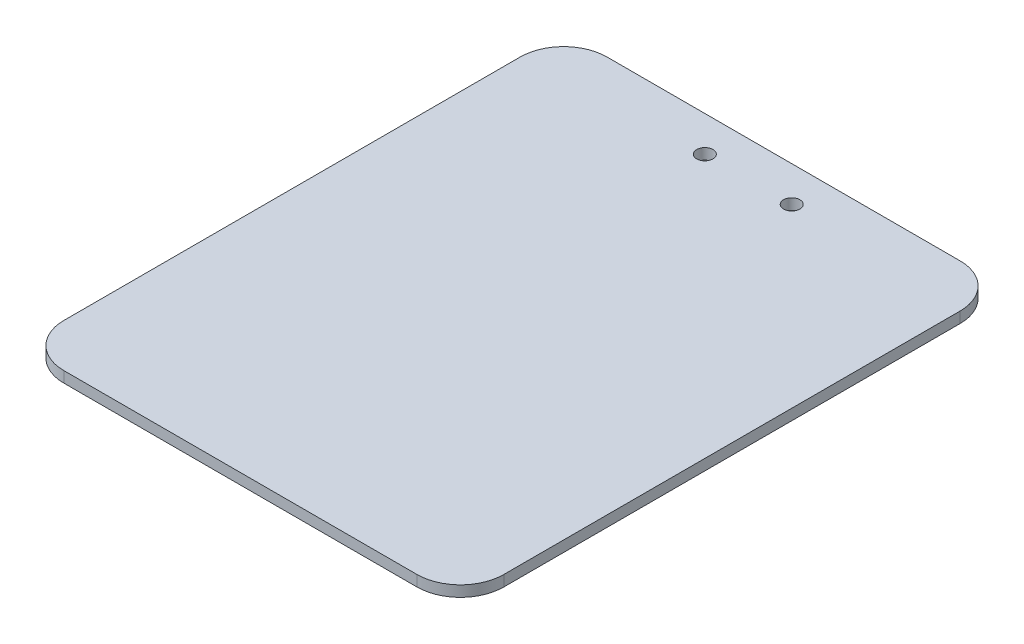
ISO-10303-21;
HEADER;
FILE_DESCRIPTION(('STEP AP214'),'2;1');
FILE_NAME('part.step','',(''),(''),'','','');
FILE_SCHEMA(('AUTOMOTIVE_DESIGN { 1 0 10303 214 1 1 1 1 }'));
ENDSEC;
DATA;
#1=APPLICATION_CONTEXT('core data for automotive mechanical design processes');
#2=APPLICATION_PROTOCOL_DEFINITION('international standard','automotive_design',2000,#1);
#3=PRODUCT_CONTEXT('',#1,'mechanical');
#4=PRODUCT('Part','Part','',(#3));
#5=PRODUCT_RELATED_PRODUCT_CATEGORY('part','',(#4));
#6=PRODUCT_DEFINITION_FORMATION('','',#4);
#7=PRODUCT_DEFINITION_CONTEXT('part definition',#1,'design');
#8=PRODUCT_DEFINITION('design','',#6,#7);
#9=PRODUCT_DEFINITION_SHAPE('','',#8);
#10=(LENGTH_UNIT() NAMED_UNIT(*) SI_UNIT(.MILLI.,.METRE.));
#11=(NAMED_UNIT(*) PLANE_ANGLE_UNIT() SI_UNIT($,.RADIAN.));
#12=(NAMED_UNIT(*) SI_UNIT($,.STERADIAN.) SOLID_ANGLE_UNIT());
#13=UNCERTAINTY_MEASURE_WITH_UNIT(LENGTH_MEASURE(1.E-05),#10,'distance_accuracy_value','');
#14=(GEOMETRIC_REPRESENTATION_CONTEXT(3) GLOBAL_UNCERTAINTY_ASSIGNED_CONTEXT((#13)) GLOBAL_UNIT_ASSIGNED_CONTEXT((#10,
#11,#12)) REPRESENTATION_CONTEXT('',''));
#15=CARTESIAN_POINT('',(0.,0.,0.));
#16=DIRECTION('',(0.,0.,1.));
#17=DIRECTION('',(1.,0.,0.));
#18=AXIS2_PLACEMENT_3D('',#15,#16,#17);
#19=CARTESIAN_POINT('',(8.,2.,-8.));
#20=DIRECTION('',(0.,-1.,0.));
#21=DIRECTION('',(0.,0.,-1.));
#22=AXIS2_PLACEMENT_3D('',#19,#20,#21);
#23=PLANE('',#22);
#24=CARTESIAN_POINT('',(8.,2.,-8.));
#25=DIRECTION('',(0.,1.,0.));
#26=DIRECTION('',(0.,0.,-1.));
#27=AXIS2_PLACEMENT_3D('',#24,#25,#26);
#28=CIRCLE('',#27,8.);
#29=CARTESIAN_POINT('',(0.,2.,-8.00000000000006));
#30=VERTEX_POINT('',#29);
#31=CARTESIAN_POINT('',(8.00000000000006,2.,0.));
#32=VERTEX_POINT('',#31);
#33=EDGE_CURVE('E170',#30,#32,#28,.T.);
#34=ORIENTED_EDGE('',*,*,#33,.T.);
#35=DIRECTION('',(1.,0.,0.));
#36=VECTOR('',#35,1.);
#37=CARTESIAN_POINT('',(8.00000000000006,2.,0.));
#38=LINE('',#37,#36);
#39=CARTESIAN_POINT('',(72.9999999999999,2.,0.));
#40=VERTEX_POINT('',#39);
#41=EDGE_CURVE('E106',#32,#40,#38,.T.);
#42=ORIENTED_EDGE('',*,*,#41,.T.);
#43=CARTESIAN_POINT('',(73.,2.,-8.));
#44=DIRECTION('',(0.,1.,0.));
#45=DIRECTION('',(0.,0.,1.));
#46=AXIS2_PLACEMENT_3D('',#43,#44,#45);
#47=CIRCLE('',#46,8.);
#48=CARTESIAN_POINT('',(81.,2.,-8.00000000000005));
#49=VERTEX_POINT('',#48);
#50=EDGE_CURVE('E191',#40,#49,#47,.T.);
#51=ORIENTED_EDGE('',*,*,#50,.T.);
#52=DIRECTION('',(0.,0.,-1.));
#53=VECTOR('',#52,1.);
#54=CARTESIAN_POINT('',(81.,2.,-8.00000000000006));
#55=LINE('',#54,#53);
#56=CARTESIAN_POINT('',(81.,2.,-91.9999999999999));
#57=VERTEX_POINT('',#56);
#58=EDGE_CURVE('E205',#49,#57,#55,.T.);
#59=ORIENTED_EDGE('',*,*,#58,.T.);
#60=CARTESIAN_POINT('',(73.,2.,-92.));
#61=DIRECTION('',(0.,1.,0.));
#62=DIRECTION('',(0.,0.,-1.));
#63=AXIS2_PLACEMENT_3D('',#60,#61,#62);
#64=CIRCLE('',#63,7.99999999999999);
#65=CARTESIAN_POINT('',(72.9999999999999,2.,-100.));
#66=VERTEX_POINT('',#65);
#67=EDGE_CURVE('E125',#57,#66,#64,.T.);
#68=ORIENTED_EDGE('',*,*,#67,.T.);
#69=DIRECTION('',(-1.,0.,0.));
#70=VECTOR('',#69,1.);
#71=CARTESIAN_POINT('',(8.00000000000006,2.,-100.));
#72=LINE('',#71,#70);
#73=CARTESIAN_POINT('',(8.00000000000006,2.,-100.));
#74=VERTEX_POINT('',#73);
#75=EDGE_CURVE('E119',#66,#74,#72,.T.);
#76=ORIENTED_EDGE('',*,*,#75,.T.);
#77=CARTESIAN_POINT('',(8.,2.,-92.));
#78=DIRECTION('',(0.,1.,0.));
#79=DIRECTION('',(0.,0.,-1.));
#80=AXIS2_PLACEMENT_3D('',#77,#78,#79);
#81=CIRCLE('',#80,8.);
#82=CARTESIAN_POINT('',(0.,2.,-91.9999999999999));
#83=VERTEX_POINT('',#82);
#84=EDGE_CURVE('E123',#74,#83,#81,.T.);
#85=ORIENTED_EDGE('',*,*,#84,.T.);
#86=DIRECTION('',(0.,0.,1.));
#87=VECTOR('',#86,1.);
#88=CARTESIAN_POINT('',(0.,2.,-8.00000000000006));
#89=LINE('',#88,#87);
#90=EDGE_CURVE('E63',#83,#30,#89,.T.);
#91=ORIENTED_EDGE('',*,*,#90,.T.);
#92=EDGE_LOOP('',(#34,#42,#51,#59,#68,#76,#85,#91));
#93=FACE_BOUND('',#92,.T.);
#94=CARTESIAN_POINT('',(48.5,2.,-93.5));
#95=DIRECTION('',(0.,1.,0.));
#96=DIRECTION('',(0.,0.,1.));
#97=AXIS2_PLACEMENT_3D('',#94,#95,#96);
#98=CIRCLE('',#97,1.5);
#99=CARTESIAN_POINT('',(48.5,2.,-92.));
#100=VERTEX_POINT('',#99);
#101=EDGE_CURVE('E152',#100,#100,#98,.T.);
#102=ORIENTED_EDGE('',*,*,#101,.F.);
#103=EDGE_LOOP('',(#102));
#104=FACE_BOUND('',#103,.T.);
#105=CARTESIAN_POINT('',(32.5,2.,-93.5));
#106=DIRECTION('',(0.,1.,0.));
#107=DIRECTION('',(0.,0.,-1.));
#108=AXIS2_PLACEMENT_3D('',#105,#106,#107);
#109=CIRCLE('',#108,1.5);
#110=CARTESIAN_POINT('',(32.5,2.,-95.));
#111=VERTEX_POINT('',#110);
#112=EDGE_CURVE('E219',#111,#111,#109,.T.);
#113=ORIENTED_EDGE('',*,*,#112,.F.);
#114=EDGE_LOOP('',(#113));
#115=FACE_BOUND('',#114,.T.);
#116=ADVANCED_FACE('F45',(#93,#104,#115),#23,.F.);
#117=CARTESIAN_POINT('',(8.,0.,-8.));
#118=DIRECTION('',(0.,-1.,0.));
#119=DIRECTION('',(0.,0.,-1.));
#120=AXIS2_PLACEMENT_3D('',#117,#118,#119);
#121=PLANE('',#120);
#122=CARTESIAN_POINT('',(48.5,0.,-93.5));
#123=DIRECTION('',(0.,1.,0.));
#124=DIRECTION('',(0.,0.,1.));
#125=AXIS2_PLACEMENT_3D('',#122,#123,#124);
#126=CIRCLE('',#125,1.5);
#127=CARTESIAN_POINT('',(48.5,0.,-92.));
#128=VERTEX_POINT('',#127);
#129=EDGE_CURVE('E215',#128,#128,#126,.T.);
#130=ORIENTED_EDGE('',*,*,#129,.T.);
#131=EDGE_LOOP('',(#130));
#132=FACE_BOUND('',#131,.T.);
#133=CARTESIAN_POINT('',(8.,0.,-8.));
#134=DIRECTION('',(0.,1.,0.));
#135=DIRECTION('',(0.,0.,-1.));
#136=AXIS2_PLACEMENT_3D('',#133,#134,#135);
#137=CIRCLE('',#136,8.);
#138=CARTESIAN_POINT('',(0.,0.,-8.00000000000006));
#139=VERTEX_POINT('',#138);
#140=CARTESIAN_POINT('',(8.00000000000006,0.,0.));
#141=VERTEX_POINT('',#140);
#142=EDGE_CURVE('E147',#139,#141,#137,.T.);
#143=ORIENTED_EDGE('',*,*,#142,.F.);
#144=DIRECTION('',(0.,0.,1.));
#145=VECTOR('',#144,1.);
#146=CARTESIAN_POINT('',(0.,0.,-8.00000000000006));
#147=LINE('',#146,#145);
#148=CARTESIAN_POINT('',(0.,0.,-91.9999999999999));
#149=VERTEX_POINT('',#148);
#150=EDGE_CURVE('E98',#149,#139,#147,.T.);
#151=ORIENTED_EDGE('',*,*,#150,.F.);
#152=CARTESIAN_POINT('',(8.,0.,-92.));
#153=DIRECTION('',(0.,1.,0.));
#154=DIRECTION('',(0.,0.,-1.));
#155=AXIS2_PLACEMENT_3D('',#152,#153,#154);
#156=CIRCLE('',#155,8.);
#157=CARTESIAN_POINT('',(8.00000000000006,0.,-100.));
#158=VERTEX_POINT('',#157);
#159=EDGE_CURVE('E92',#158,#149,#156,.T.);
#160=ORIENTED_EDGE('',*,*,#159,.F.);
#161=DIRECTION('',(-1.,0.,0.));
#162=VECTOR('',#161,1.);
#163=CARTESIAN_POINT('',(8.00000000000006,0.,-100.));
#164=LINE('',#163,#162);
#165=CARTESIAN_POINT('',(72.9999999999999,0.,-100.));
#166=VERTEX_POINT('',#165);
#167=EDGE_CURVE('E134',#166,#158,#164,.T.);
#168=ORIENTED_EDGE('',*,*,#167,.F.);
#169=CARTESIAN_POINT('',(73.,0.,-92.));
#170=DIRECTION('',(0.,1.,0.));
#171=DIRECTION('',(0.,0.,-1.));
#172=AXIS2_PLACEMENT_3D('',#169,#170,#171);
#173=CIRCLE('',#172,7.99999999999999);
#174=CARTESIAN_POINT('',(81.,0.,-91.9999999999999));
#175=VERTEX_POINT('',#174);
#176=EDGE_CURVE('E161',#175,#166,#173,.T.);
#177=ORIENTED_EDGE('',*,*,#176,.F.);
#178=DIRECTION('',(0.,0.,-1.));
#179=VECTOR('',#178,1.);
#180=CARTESIAN_POINT('',(81.,0.,-8.00000000000006));
#181=LINE('',#180,#179);
#182=CARTESIAN_POINT('',(81.,0.,-8.00000000000005));
#183=VERTEX_POINT('',#182);
#184=EDGE_CURVE('E158',#183,#175,#181,.T.);
#185=ORIENTED_EDGE('',*,*,#184,.F.);
#186=CARTESIAN_POINT('',(73.,0.,-8.));
#187=DIRECTION('',(0.,1.,0.));
#188=DIRECTION('',(0.,0.,1.));
#189=AXIS2_PLACEMENT_3D('',#186,#187,#188);
#190=CIRCLE('',#189,8.);
#191=CARTESIAN_POINT('',(72.9999999999999,0.,0.));
#192=VERTEX_POINT('',#191);
#193=EDGE_CURVE('E155',#192,#183,#190,.T.);
#194=ORIENTED_EDGE('',*,*,#193,.F.);
#195=DIRECTION('',(1.,0.,0.));
#196=VECTOR('',#195,1.);
#197=CARTESIAN_POINT('',(8.00000000000006,0.,0.));
#198=LINE('',#197,#196);
#199=EDGE_CURVE('E151',#141,#192,#198,.T.);
#200=ORIENTED_EDGE('',*,*,#199,.F.);
#201=EDGE_LOOP('',(#143,#151,#160,#168,#177,#185,#194,#200));
#202=FACE_BOUND('',#201,.T.);
#203=CARTESIAN_POINT('',(32.5,0.,-93.5));
#204=DIRECTION('',(0.,1.,0.));
#205=DIRECTION('',(0.,0.,-1.));
#206=AXIS2_PLACEMENT_3D('',#203,#204,#205);
#207=CIRCLE('',#206,1.5);
#208=CARTESIAN_POINT('',(32.5,0.,-95.));
#209=VERTEX_POINT('',#208);
#210=EDGE_CURVE('E223',#209,#209,#207,.T.);
#211=ORIENTED_EDGE('',*,*,#210,.T.);
#212=EDGE_LOOP('',(#211));
#213=FACE_BOUND('',#212,.T.);
#214=ADVANCED_FACE('F195',(#132,#202,#213),#121,.T.);
#215=CARTESIAN_POINT('',(8.,2.,-8.));
#216=DIRECTION('',(0.,-1.,0.));
#217=DIRECTION('',(0.,0.,-1.));
#218=AXIS2_PLACEMENT_3D('',#215,#216,#217);
#219=CYLINDRICAL_SURFACE('',#218,8.);
#220=ORIENTED_EDGE('',*,*,#142,.T.);
#221=DIRECTION('',(0.,-1.,0.));
#222=VECTOR('',#221,1.);
#223=CARTESIAN_POINT('',(8.00000000000006,2.,0.));
#224=LINE('',#223,#222);
#225=EDGE_CURVE('E11',#32,#141,#224,.T.);
#226=ORIENTED_EDGE('',*,*,#225,.F.);
#227=ORIENTED_EDGE('',*,*,#33,.F.);
#228=DIRECTION('',(0.,-1.,0.));
#229=VECTOR('',#228,1.);
#230=CARTESIAN_POINT('',(0.,2.,-8.00000000000006));
#231=LINE('',#230,#229);
#232=EDGE_CURVE('E143',#30,#139,#231,.T.);
#233=ORIENTED_EDGE('',*,*,#232,.T.);
#234=EDGE_LOOP('',(#220,#226,#227,#233));
#235=FACE_BOUND('',#234,.T.);
#236=ADVANCED_FACE('F47',(#235),#219,.T.);
#237=CARTESIAN_POINT('',(8.00000000000006,2.,0.));
#238=DIRECTION('',(0.,0.,-1.));
#239=DIRECTION('',(-1.,0.,0.));
#240=AXIS2_PLACEMENT_3D('',#237,#238,#239);
#241=PLANE('',#240);
#242=ORIENTED_EDGE('',*,*,#199,.T.);
#243=DIRECTION('',(0.,-1.,0.));
#244=VECTOR('',#243,1.);
#245=CARTESIAN_POINT('',(72.9999999999999,2.,0.));
#246=LINE('',#245,#244);
#247=EDGE_CURVE('E55',#40,#192,#246,.T.);
#248=ORIENTED_EDGE('',*,*,#247,.F.);
#249=ORIENTED_EDGE('',*,*,#41,.F.);
#250=ORIENTED_EDGE('',*,*,#225,.T.);
#251=EDGE_LOOP('',(#242,#248,#249,#250));
#252=FACE_BOUND('',#251,.T.);
#253=ADVANCED_FACE('F257',(#252),#241,.F.);
#254=CARTESIAN_POINT('',(73.,2.,-8.));
#255=DIRECTION('',(0.,-1.,0.));
#256=DIRECTION('',(0.,0.,-1.));
#257=AXIS2_PLACEMENT_3D('',#254,#255,#256);
#258=CYLINDRICAL_SURFACE('',#257,8.);
#259=ORIENTED_EDGE('',*,*,#193,.T.);
#260=DIRECTION('',(0.,-1.,0.));
#261=VECTOR('',#260,1.);
#262=CARTESIAN_POINT('',(81.,2.,-8.00000000000005));
#263=LINE('',#262,#261);
#264=EDGE_CURVE('E181',#49,#183,#263,.T.);
#265=ORIENTED_EDGE('',*,*,#264,.F.);
#266=ORIENTED_EDGE('',*,*,#50,.F.);
#267=ORIENTED_EDGE('',*,*,#247,.T.);
#268=EDGE_LOOP('',(#259,#265,#266,#267));
#269=FACE_BOUND('',#268,.T.);
#270=ADVANCED_FACE('F189',(#269),#258,.T.);
#271=CARTESIAN_POINT('',(81.,2.,-8.00000000000006));
#272=DIRECTION('',(-1.,0.,0.));
#273=DIRECTION('',(0.,0.,1.));
#274=AXIS2_PLACEMENT_3D('',#271,#272,#273);
#275=PLANE('',#274);
#276=ORIENTED_EDGE('',*,*,#184,.T.);
#277=DIRECTION('',(0.,-1.,0.));
#278=VECTOR('',#277,1.);
#279=CARTESIAN_POINT('',(81.,2.,-91.9999999999999));
#280=LINE('',#279,#278);
#281=EDGE_CURVE('E177',#57,#175,#280,.T.);
#282=ORIENTED_EDGE('',*,*,#281,.F.);
#283=ORIENTED_EDGE('',*,*,#58,.F.);
#284=ORIENTED_EDGE('',*,*,#264,.T.);
#285=EDGE_LOOP('',(#276,#282,#283,#284));
#286=FACE_BOUND('',#285,.T.);
#287=ADVANCED_FACE('F200',(#286),#275,.F.);
#288=CARTESIAN_POINT('',(73.,2.,-92.));
#289=DIRECTION('',(0.,-1.,0.));
#290=DIRECTION('',(0.,0.,-1.));
#291=AXIS2_PLACEMENT_3D('',#288,#289,#290);
#292=CYLINDRICAL_SURFACE('',#291,7.99999999999999);
#293=ORIENTED_EDGE('',*,*,#176,.T.);
#294=DIRECTION('',(0.,-1.,0.));
#295=VECTOR('',#294,1.);
#296=CARTESIAN_POINT('',(72.9999999999999,2.,-100.));
#297=LINE('',#296,#295);
#298=EDGE_CURVE('E136',#66,#166,#297,.T.);
#299=ORIENTED_EDGE('',*,*,#298,.F.);
#300=ORIENTED_EDGE('',*,*,#67,.F.);
#301=ORIENTED_EDGE('',*,*,#281,.T.);
#302=EDGE_LOOP('',(#293,#299,#300,#301));
#303=FACE_BOUND('',#302,.T.);
#304=ADVANCED_FACE('F203',(#303),#292,.T.);
#305=CARTESIAN_POINT('',(8.00000000000006,2.,-100.));
#306=DIRECTION('',(0.,0.,1.));
#307=DIRECTION('',(1.,0.,0.));
#308=AXIS2_PLACEMENT_3D('',#305,#306,#307);
#309=PLANE('',#308);
#310=ORIENTED_EDGE('',*,*,#167,.T.);
#311=DIRECTION('',(0.,-1.,0.));
#312=VECTOR('',#311,1.);
#313=CARTESIAN_POINT('',(8.00000000000006,2.,-100.));
#314=LINE('',#313,#312);
#315=EDGE_CURVE('E131',#74,#158,#314,.T.);
#316=ORIENTED_EDGE('',*,*,#315,.F.);
#317=ORIENTED_EDGE('',*,*,#75,.F.);
#318=ORIENTED_EDGE('',*,*,#298,.T.);
#319=EDGE_LOOP('',(#310,#316,#317,#318));
#320=FACE_BOUND('',#319,.T.);
#321=ADVANCED_FACE('F132',(#320),#309,.F.);
#322=CARTESIAN_POINT('',(8.,2.,-92.));
#323=DIRECTION('',(0.,-1.,0.));
#324=DIRECTION('',(0.,0.,-1.));
#325=AXIS2_PLACEMENT_3D('',#322,#323,#324);
#326=CYLINDRICAL_SURFACE('',#325,8.);
#327=ORIENTED_EDGE('',*,*,#159,.T.);
#328=DIRECTION('',(0.,-1.,0.));
#329=VECTOR('',#328,1.);
#330=CARTESIAN_POINT('',(0.,2.,-91.9999999999999));
#331=LINE('',#330,#329);
#332=EDGE_CURVE('E137',#83,#149,#331,.T.);
#333=ORIENTED_EDGE('',*,*,#332,.F.);
#334=ORIENTED_EDGE('',*,*,#84,.F.);
#335=ORIENTED_EDGE('',*,*,#315,.T.);
#336=EDGE_LOOP('',(#327,#333,#334,#335));
#337=FACE_BOUND('',#336,.T.);
#338=ADVANCED_FACE('F139',(#337),#326,.T.);
#339=CARTESIAN_POINT('',(0.,2.,-8.00000000000006));
#340=DIRECTION('',(1.,0.,0.));
#341=DIRECTION('',(0.,0.,-1.));
#342=AXIS2_PLACEMENT_3D('',#339,#340,#341);
#343=PLANE('',#342);
#344=ORIENTED_EDGE('',*,*,#150,.T.);
#345=ORIENTED_EDGE('',*,*,#232,.F.);
#346=ORIENTED_EDGE('',*,*,#90,.F.);
#347=ORIENTED_EDGE('',*,*,#332,.T.);
#348=EDGE_LOOP('',(#344,#345,#346,#347));
#349=FACE_BOUND('',#348,.T.);
#350=ADVANCED_FACE('F245',(#349),#343,.F.);
#351=CARTESIAN_POINT('',(48.5,2.,-93.5));
#352=DIRECTION('',(0.,-1.,0.));
#353=DIRECTION('',(0.,0.,-1.));
#354=AXIS2_PLACEMENT_3D('',#351,#352,#353);
#355=CYLINDRICAL_SURFACE('',#354,1.5);
#356=ORIENTED_EDGE('',*,*,#101,.T.);
#357=EDGE_LOOP('',(#356));
#358=FACE_BOUND('',#357,.T.);
#359=ORIENTED_EDGE('',*,*,#129,.F.);
#360=EDGE_LOOP('',(#359));
#361=FACE_BOUND('',#360,.T.);
#362=ADVANCED_FACE('F242',(#358,#361),#355,.F.);
#363=CARTESIAN_POINT('',(32.5,2.,-93.5));
#364=DIRECTION('',(0.,-1.,0.));
#365=DIRECTION('',(0.,0.,-1.));
#366=AXIS2_PLACEMENT_3D('',#363,#364,#365);
#367=CYLINDRICAL_SURFACE('',#366,1.5);
#368=ORIENTED_EDGE('',*,*,#112,.T.);
#369=EDGE_LOOP('',(#368));
#370=FACE_BOUND('',#369,.T.);
#371=ORIENTED_EDGE('',*,*,#210,.F.);
#372=EDGE_LOOP('',(#371));
#373=FACE_BOUND('',#372,.T.);
#374=ADVANCED_FACE('F231',(#370,#373),#367,.F.);
#375=CLOSED_SHELL('',(#116,#214,#236,#253,#270,#287,#304,#321,#338,#350,#362,#374));
#376=MANIFOLD_SOLID_BREP('B2',#375);
#377=ADVANCED_BREP_SHAPE_REPRESENTATION('',(#18,#376),#14);
#378=SHAPE_DEFINITION_REPRESENTATION(#9,#377);
ENDSEC;
END-ISO-10303-21;
